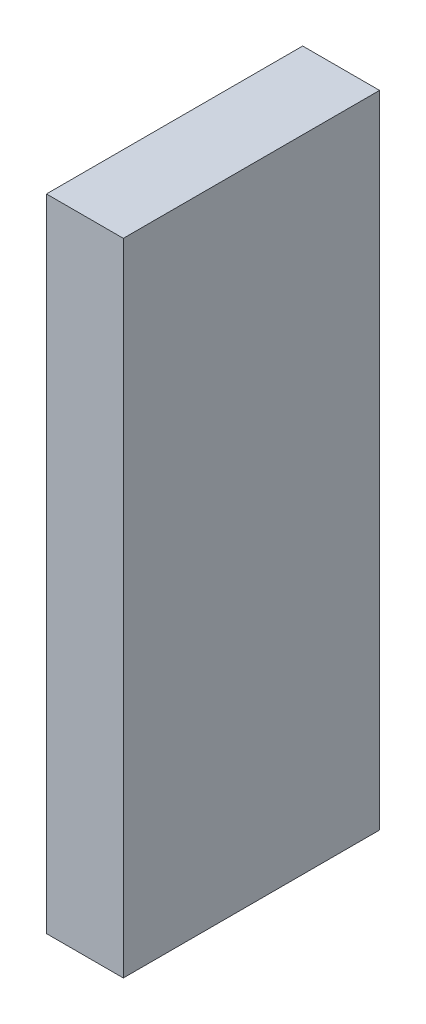
ISO-10303-21;
HEADER;
FILE_DESCRIPTION(('STEP AP214'),'2;1');
FILE_NAME('part.step','',(''),(''),'','','');
FILE_SCHEMA(('AUTOMOTIVE_DESIGN { 1 0 10303 214 1 1 1 1 }'));
ENDSEC;
DATA;
#1=APPLICATION_CONTEXT('core data for automotive mechanical design processes');
#2=APPLICATION_PROTOCOL_DEFINITION('international standard','automotive_design',2000,#1);
#3=PRODUCT_CONTEXT('',#1,'mechanical');
#4=PRODUCT('Part','Part','',(#3));
#5=PRODUCT_RELATED_PRODUCT_CATEGORY('part','',(#4));
#6=PRODUCT_DEFINITION_FORMATION('','',#4);
#7=PRODUCT_DEFINITION_CONTEXT('part definition',#1,'design');
#8=PRODUCT_DEFINITION('design','',#6,#7);
#9=PRODUCT_DEFINITION_SHAPE('','',#8);
#10=(LENGTH_UNIT() NAMED_UNIT(*) SI_UNIT(.MILLI.,.METRE.));
#11=(NAMED_UNIT(*) PLANE_ANGLE_UNIT() SI_UNIT($,.RADIAN.));
#12=(NAMED_UNIT(*) SI_UNIT($,.STERADIAN.) SOLID_ANGLE_UNIT());
#13=UNCERTAINTY_MEASURE_WITH_UNIT(LENGTH_MEASURE(1.E-05),#10,'distance_accuracy_value','');
#14=(GEOMETRIC_REPRESENTATION_CONTEXT(3) GLOBAL_UNCERTAINTY_ASSIGNED_CONTEXT((#13)) GLOBAL_UNIT_ASSIGNED_CONTEXT((#10,
#11,#12)) REPRESENTATION_CONTEXT('',''));
#15=CARTESIAN_POINT('',(0.,0.,0.));
#16=DIRECTION('',(0.,0.,1.));
#17=DIRECTION('',(1.,0.,0.));
#18=AXIS2_PLACEMENT_3D('',#15,#16,#17);
#19=CARTESIAN_POINT('',(1.5,12.5,-5.));
#20=DIRECTION('',(-1.,0.,0.));
#21=DIRECTION('',(0.,0.,1.));
#22=AXIS2_PLACEMENT_3D('',#19,#20,#21);
#23=PLANE('',#22);
#24=DIRECTION('',(0.,0.,-1.));
#25=VECTOR('',#24,1.);
#26=CARTESIAN_POINT('',(1.5,-12.5,-5.));
#27=LINE('',#26,#25);
#28=CARTESIAN_POINT('',(1.5,-12.5,5.));
#29=VERTEX_POINT('',#28);
#30=CARTESIAN_POINT('',(1.5,-12.5,-5.));
#31=VERTEX_POINT('',#30);
#32=EDGE_CURVE('E106',#29,#31,#27,.T.);
#33=ORIENTED_EDGE('',*,*,#32,.T.);
#34=DIRECTION('',(0.,-1.,0.));
#35=VECTOR('',#34,1.);
#36=CARTESIAN_POINT('',(1.5,12.5,-5.));
#37=LINE('',#36,#35);
#38=CARTESIAN_POINT('',(1.5,12.5,-5.));
#39=VERTEX_POINT('',#38);
#40=EDGE_CURVE('E11',#39,#31,#37,.T.);
#41=ORIENTED_EDGE('',*,*,#40,.F.);
#42=DIRECTION('',(0.,0.,-1.));
#43=VECTOR('',#42,1.);
#44=CARTESIAN_POINT('',(1.5,12.5,-5.));
#45=LINE('',#44,#43);
#46=CARTESIAN_POINT('',(1.5,12.5,5.));
#47=VERTEX_POINT('',#46);
#48=EDGE_CURVE('E90',#47,#39,#45,.T.);
#49=ORIENTED_EDGE('',*,*,#48,.F.);
#50=DIRECTION('',(0.,-1.,0.));
#51=VECTOR('',#50,1.);
#52=CARTESIAN_POINT('',(1.5,12.5,5.));
#53=LINE('',#52,#51);
#54=EDGE_CURVE('E102',#47,#29,#53,.T.);
#55=ORIENTED_EDGE('',*,*,#54,.T.);
#56=EDGE_LOOP('',(#33,#41,#49,#55));
#57=FACE_BOUND('',#56,.T.);
#58=ADVANCED_FACE('F38',(#57),#23,.F.);
#59=CARTESIAN_POINT('',(-1.5,12.5,-5.));
#60=DIRECTION('',(0.,0.,1.));
#61=DIRECTION('',(1.,0.,0.));
#62=AXIS2_PLACEMENT_3D('',#59,#60,#61);
#63=PLANE('',#62);
#64=DIRECTION('',(-1.,0.,0.));
#65=VECTOR('',#64,1.);
#66=CARTESIAN_POINT('',(-1.5,-12.5,-5.));
#67=LINE('',#66,#65);
#68=CARTESIAN_POINT('',(-1.5,-12.5,-5.));
#69=VERTEX_POINT('',#68);
#70=EDGE_CURVE('E95',#31,#69,#67,.T.);
#71=ORIENTED_EDGE('',*,*,#70,.T.);
#72=DIRECTION('',(0.,-1.,0.));
#73=VECTOR('',#72,1.);
#74=CARTESIAN_POINT('',(-1.5,12.5,-5.));
#75=LINE('',#74,#73);
#76=CARTESIAN_POINT('',(-1.5,12.5,-5.));
#77=VERTEX_POINT('',#76);
#78=EDGE_CURVE('E47',#77,#69,#75,.T.);
#79=ORIENTED_EDGE('',*,*,#78,.F.);
#80=DIRECTION('',(-1.,0.,0.));
#81=VECTOR('',#80,1.);
#82=CARTESIAN_POINT('',(-1.5,12.5,-5.));
#83=LINE('',#82,#81);
#84=EDGE_CURVE('E85',#39,#77,#83,.T.);
#85=ORIENTED_EDGE('',*,*,#84,.F.);
#86=ORIENTED_EDGE('',*,*,#40,.T.);
#87=EDGE_LOOP('',(#71,#79,#85,#86));
#88=FACE_BOUND('',#87,.T.);
#89=ADVANCED_FACE('F94',(#88),#63,.F.);
#90=CARTESIAN_POINT('',(-1.5,12.5,-5.));
#91=DIRECTION('',(1.,0.,0.));
#92=DIRECTION('',(0.,0.,-1.));
#93=AXIS2_PLACEMENT_3D('',#90,#91,#92);
#94=PLANE('',#93);
#95=DIRECTION('',(0.,0.,1.));
#96=VECTOR('',#95,1.);
#97=CARTESIAN_POINT('',(-1.5,-12.5,-5.));
#98=LINE('',#97,#96);
#99=CARTESIAN_POINT('',(-1.5,-12.5,5.));
#100=VERTEX_POINT('',#99);
#101=EDGE_CURVE('E72',#69,#100,#98,.T.);
#102=ORIENTED_EDGE('',*,*,#101,.T.);
#103=DIRECTION('',(0.,-1.,0.));
#104=VECTOR('',#103,1.);
#105=CARTESIAN_POINT('',(-1.5,12.5,5.));
#106=LINE('',#105,#104);
#107=CARTESIAN_POINT('',(-1.5,12.5,5.));
#108=VERTEX_POINT('',#107);
#109=EDGE_CURVE('E97',#108,#100,#106,.T.);
#110=ORIENTED_EDGE('',*,*,#109,.F.);
#111=DIRECTION('',(0.,0.,1.));
#112=VECTOR('',#111,1.);
#113=CARTESIAN_POINT('',(-1.5,12.5,-5.));
#114=LINE('',#113,#112);
#115=EDGE_CURVE('E88',#77,#108,#114,.T.);
#116=ORIENTED_EDGE('',*,*,#115,.F.);
#117=ORIENTED_EDGE('',*,*,#78,.T.);
#118=EDGE_LOOP('',(#102,#110,#116,#117));
#119=FACE_BOUND('',#118,.T.);
#120=ADVANCED_FACE('F98',(#119),#94,.F.);
#121=CARTESIAN_POINT('',(-1.5,12.5,5.));
#122=DIRECTION('',(0.,0.,-1.));
#123=DIRECTION('',(-1.,0.,0.));
#124=AXIS2_PLACEMENT_3D('',#121,#122,#123);
#125=PLANE('',#124);
#126=DIRECTION('',(1.,0.,0.));
#127=VECTOR('',#126,1.);
#128=CARTESIAN_POINT('',(-1.5,-12.5,5.));
#129=LINE('',#128,#127);
#130=EDGE_CURVE('E78',#100,#29,#129,.T.);
#131=ORIENTED_EDGE('',*,*,#130,.T.);
#132=ORIENTED_EDGE('',*,*,#54,.F.);
#133=DIRECTION('',(1.,0.,0.));
#134=VECTOR('',#133,1.);
#135=CARTESIAN_POINT('',(-1.5,12.5,5.));
#136=LINE('',#135,#134);
#137=EDGE_CURVE('E55',#108,#47,#136,.T.);
#138=ORIENTED_EDGE('',*,*,#137,.F.);
#139=ORIENTED_EDGE('',*,*,#109,.T.);
#140=EDGE_LOOP('',(#131,#132,#138,#139));
#141=FACE_BOUND('',#140,.T.);
#142=ADVANCED_FACE('F119',(#141),#125,.F.);
#143=CARTESIAN_POINT('',(0.,12.5,0.));
#144=DIRECTION('',(0.,1.,0.));
#145=DIRECTION('',(0.,0.,1.));
#146=AXIS2_PLACEMENT_3D('',#143,#144,#145);
#147=PLANE('',#146);
#148=ORIENTED_EDGE('',*,*,#48,.T.);
#149=ORIENTED_EDGE('',*,*,#84,.T.);
#150=ORIENTED_EDGE('',*,*,#115,.T.);
#151=ORIENTED_EDGE('',*,*,#137,.T.);
#152=EDGE_LOOP('',(#148,#149,#150,#151));
#153=FACE_BOUND('',#152,.T.);
#154=ADVANCED_FACE('F86',(#153),#147,.T.);
#155=CARTESIAN_POINT('',(0.,-12.5,0.));
#156=DIRECTION('',(0.,1.,0.));
#157=DIRECTION('',(0.,0.,1.));
#158=AXIS2_PLACEMENT_3D('',#155,#156,#157);
#159=PLANE('',#158);
#160=ORIENTED_EDGE('',*,*,#32,.F.);
#161=ORIENTED_EDGE('',*,*,#130,.F.);
#162=ORIENTED_EDGE('',*,*,#101,.F.);
#163=ORIENTED_EDGE('',*,*,#70,.F.);
#164=EDGE_LOOP('',(#160,#161,#162,#163));
#165=FACE_BOUND('',#164,.T.);
#166=ADVANCED_FACE('F122',(#165),#159,.F.);
#167=CLOSED_SHELL('',(#58,#89,#120,#142,#154,#166));
#168=MANIFOLD_SOLID_BREP('B2',#167);
#169=ADVANCED_BREP_SHAPE_REPRESENTATION('',(#18,#168),#14);
#170=SHAPE_DEFINITION_REPRESENTATION(#9,#169);
ENDSEC;
END-ISO-10303-21;
